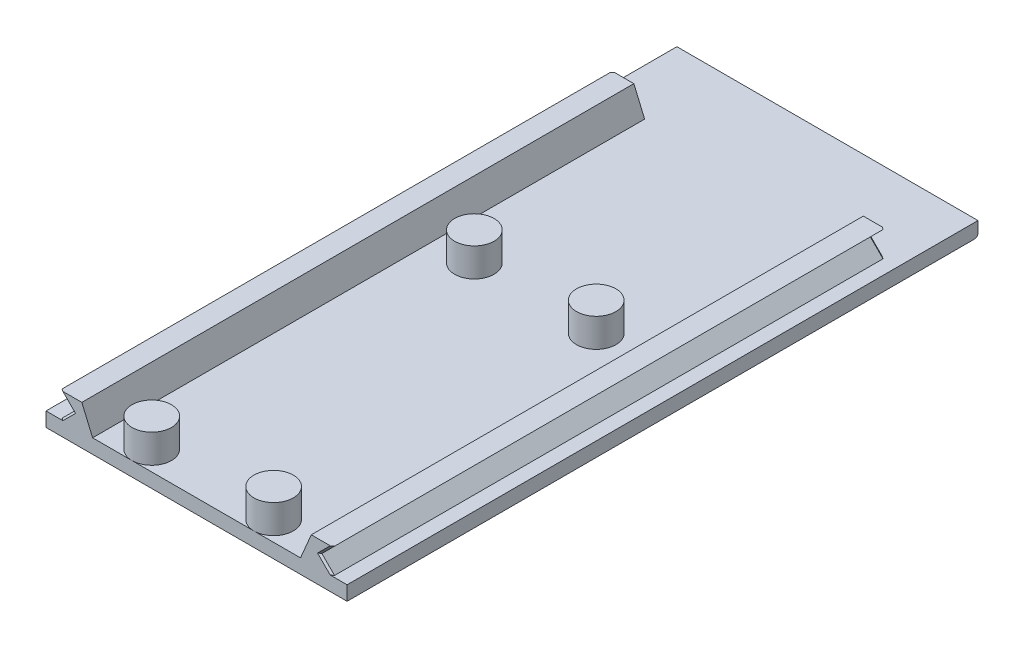
ISO-10303-21;
HEADER;
FILE_DESCRIPTION(('STEP AP214'),'2;1');
FILE_NAME('part.step','',(''),(''),'','','');
FILE_SCHEMA(('AUTOMOTIVE_DESIGN { 1 0 10303 214 1 1 1 1 }'));
ENDSEC;
DATA;
#1=APPLICATION_CONTEXT('core data for automotive mechanical design processes');
#2=APPLICATION_PROTOCOL_DEFINITION('international standard','automotive_design',2000,#1);
#3=PRODUCT_CONTEXT('',#1,'mechanical');
#4=PRODUCT('Part','Part','',(#3));
#5=PRODUCT_RELATED_PRODUCT_CATEGORY('part','',(#4));
#6=PRODUCT_DEFINITION_FORMATION('','',#4);
#7=PRODUCT_DEFINITION_CONTEXT('part definition',#1,'design');
#8=PRODUCT_DEFINITION('design','',#6,#7);
#9=PRODUCT_DEFINITION_SHAPE('','',#8);
#10=(LENGTH_UNIT() NAMED_UNIT(*) SI_UNIT(.MILLI.,.METRE.));
#11=(NAMED_UNIT(*) PLANE_ANGLE_UNIT() SI_UNIT($,.RADIAN.));
#12=(NAMED_UNIT(*) SI_UNIT($,.STERADIAN.) SOLID_ANGLE_UNIT());
#13=UNCERTAINTY_MEASURE_WITH_UNIT(LENGTH_MEASURE(1.E-05),#10,'distance_accuracy_value','');
#14=(GEOMETRIC_REPRESENTATION_CONTEXT(3) GLOBAL_UNCERTAINTY_ASSIGNED_CONTEXT((#13)) GLOBAL_UNIT_ASSIGNED_CONTEXT((#10,
#11,#12)) REPRESENTATION_CONTEXT('',''));
#15=CARTESIAN_POINT('',(0.,0.,0.));
#16=DIRECTION('',(0.,0.,1.));
#17=DIRECTION('',(1.,0.,0.));
#18=AXIS2_PLACEMENT_3D('',#15,#16,#17);
#19=CARTESIAN_POINT('',(0.,2.,0.));
#20=DIRECTION('',(0.,1.,0.));
#21=DIRECTION('',(0.,0.,1.));
#22=AXIS2_PLACEMENT_3D('',#19,#20,#21);
#23=PLANE('',#22);
#24=CARTESIAN_POINT('',(-9.00000000000015,2.,-3.75));
#25=DIRECTION('',(0.,1.,0.));
#26=DIRECTION('',(0.,0.,1.));
#27=AXIS2_PLACEMENT_3D('',#24,#25,#26);
#28=CIRCLE('',#27,2.75);
#29=CARTESIAN_POINT('',(-9.00000000000015,2.,-0.999999999999997));
#30=VERTEX_POINT('',#29);
#31=EDGE_CURVE('E412',#30,#30,#28,.T.);
#32=ORIENTED_EDGE('',*,*,#31,.F.);
#33=EDGE_LOOP('',(#32));
#34=FACE_BOUND('',#33,.T.);
#35=CARTESIAN_POINT('',(7.99999999999985,2.,-3.75));
#36=DIRECTION('',(0.,1.,0.));
#37=DIRECTION('',(0.,0.,1.));
#38=AXIS2_PLACEMENT_3D('',#35,#36,#37);
#39=CIRCLE('',#38,2.75);
#40=CARTESIAN_POINT('',(7.99999999999985,2.,-0.999999999999995));
#41=VERTEX_POINT('',#40);
#42=EDGE_CURVE('E618',#41,#41,#39,.T.);
#43=ORIENTED_EDGE('',*,*,#42,.F.);
#44=EDGE_LOOP('',(#43));
#45=FACE_BOUND('',#44,.T.);
#46=DIRECTION('',(1.,0.,0.));
#47=VECTOR('',#46,1.);
#48=CARTESIAN_POINT('',(-21.,2.,44.));
#49=LINE('',#48,#47);
#50=CARTESIAN_POINT('',(-9.,2.,44.));
#51=VERTEX_POINT('',#50);
#52=CARTESIAN_POINT('',(8.,2.,44.));
#53=VERTEX_POINT('',#52);
#54=EDGE_CURVE('E470',#51,#53,#49,.T.);
#55=ORIENTED_EDGE('',*,*,#54,.T.);
#56=CARTESIAN_POINT('',(8.,2.,41.25));
#57=DIRECTION('',(0.,1.,0.));
#58=DIRECTION('',(0.,0.,1.));
#59=AXIS2_PLACEMENT_3D('',#56,#57,#58);
#60=CIRCLE('',#59,2.75);
#61=EDGE_CURVE('E468',#53,#53,#60,.T.);
#62=ORIENTED_EDGE('',*,*,#61,.F.);
#63=CARTESIAN_POINT('',(14.5,2.,44.));
#64=VERTEX_POINT('',#63);
#65=EDGE_CURVE('E303',#53,#64,#49,.T.);
#66=ORIENTED_EDGE('',*,*,#65,.T.);
#67=DIRECTION('',(0.,0.,1.));
#68=VECTOR('',#67,1.);
#69=CARTESIAN_POINT('',(14.5,2.,-33.));
#70=LINE('',#69,#68);
#71=CARTESIAN_POINT('',(14.5,2.,-33.));
#72=VERTEX_POINT('',#71);
#73=EDGE_CURVE('E267',#72,#64,#70,.T.);
#74=ORIENTED_EDGE('',*,*,#73,.F.);
#75=DIRECTION('',(1.,0.,0.));
#76=VECTOR('',#75,1.);
#77=CARTESIAN_POINT('',(19.,2.,-33.));
#78=LINE('',#77,#76);
#79=CARTESIAN_POINT('',(18.6464466094067,2.,-33.));
#80=VERTEX_POINT('',#79);
#81=EDGE_CURVE('E249',#72,#80,#78,.T.);
#82=ORIENTED_EDGE('',*,*,#81,.T.);
#83=DIRECTION('',(-0.816496580927736,0.,-0.577350269189611));
#84=VECTOR('',#83,1.);
#85=CARTESIAN_POINT('',(17.8214886980224,2.,-33.5833333333333));
#86=LINE('',#85,#84);
#87=CARTESIAN_POINT('',(19.,2.,-32.75));
#88=VERTEX_POINT('',#87);
#89=EDGE_CURVE('E404',#80,#88,#86,.F.);
#90=ORIENTED_EDGE('',*,*,#89,.T.);
#91=DIRECTION('',(0.,0.,1.));
#92=VECTOR('',#91,1.);
#93=CARTESIAN_POINT('',(19.,2.,-33.));
#94=LINE('',#93,#92);
#95=CARTESIAN_POINT('',(19.,2.,43.75));
#96=VERTEX_POINT('',#95);
#97=EDGE_CURVE('E261',#88,#96,#94,.T.);
#98=ORIENTED_EDGE('',*,*,#97,.T.);
#99=DIRECTION('',(-0.81649658092773,0.,0.577350269189621));
#100=VECTOR('',#99,1.);
#101=CARTESIAN_POINT('',(5.43096440627088,2.,53.3447570824874));
#102=LINE('',#101,#100);
#103=CARTESIAN_POINT('',(18.6464466094067,2.,44.));
#104=VERTEX_POINT('',#103);
#105=EDGE_CURVE('E11',#96,#104,#102,.T.);
#106=ORIENTED_EDGE('',*,*,#105,.T.);
#107=CARTESIAN_POINT('',(21.,2.,44.));
#108=VERTEX_POINT('',#107);
#109=EDGE_CURVE('E298',#104,#108,#49,.T.);
#110=ORIENTED_EDGE('',*,*,#109,.T.);
#111=DIRECTION('',(0.,0.,-1.));
#112=VECTOR('',#111,1.);
#113=CARTESIAN_POINT('',(21.,2.,-44.));
#114=LINE('',#113,#112);
#115=CARTESIAN_POINT('',(21.,2.,-44.));
#116=VERTEX_POINT('',#115);
#117=EDGE_CURVE('E287',#108,#116,#114,.T.);
#118=ORIENTED_EDGE('',*,*,#117,.T.);
#119=DIRECTION('',(-1.,0.,0.));
#120=VECTOR('',#119,1.);
#121=CARTESIAN_POINT('',(-21.,2.,-44.));
#122=LINE('',#121,#120);
#123=CARTESIAN_POINT('',(-21.,2.,-44.));
#124=VERTEX_POINT('',#123);
#125=EDGE_CURVE('E291',#116,#124,#122,.T.);
#126=ORIENTED_EDGE('',*,*,#125,.T.);
#127=DIRECTION('',(0.,0.,1.));
#128=VECTOR('',#127,1.);
#129=CARTESIAN_POINT('',(-21.,2.,-44.));
#130=LINE('',#129,#128);
#131=CARTESIAN_POINT('',(-21.,2.,44.));
#132=VERTEX_POINT('',#131);
#133=EDGE_CURVE('E295',#124,#132,#130,.T.);
#134=ORIENTED_EDGE('',*,*,#133,.T.);
#135=CARTESIAN_POINT('',(-18.6464466094067,2.,44.));
#136=VERTEX_POINT('',#135);
#137=EDGE_CURVE('E60',#132,#136,#49,.T.);
#138=ORIENTED_EDGE('',*,*,#137,.T.);
#139=DIRECTION('',(0.816496580927728,0.,0.577350269189623));
#140=VECTOR('',#139,1.);
#141=CARTESIAN_POINT('',(-17.8214886980224,2.,44.5833333333333));
#142=LINE('',#141,#140);
#143=CARTESIAN_POINT('',(-19.,2.,43.75));
#144=VERTEX_POINT('',#143);
#145=EDGE_CURVE('E52',#136,#144,#142,.F.);
#146=ORIENTED_EDGE('',*,*,#145,.T.);
#147=DIRECTION('',(0.,0.,1.));
#148=VECTOR('',#147,1.);
#149=CARTESIAN_POINT('',(-19.,2.,-33.));
#150=LINE('',#149,#148);
#151=CARTESIAN_POINT('',(-19.,2.,-32.75));
#152=VERTEX_POINT('',#151);
#153=EDGE_CURVE('E235',#152,#144,#150,.T.);
#154=ORIENTED_EDGE('',*,*,#153,.F.);
#155=DIRECTION('',(0.816496580927716,0.,-0.57735026918964));
#156=VECTOR('',#155,1.);
#157=CARTESIAN_POINT('',(-13.0976310729379,2.,-36.9236050933905));
#158=LINE('',#157,#156);
#159=CARTESIAN_POINT('',(-18.6464466094068,2.,-33.));
#160=VERTEX_POINT('',#159);
#161=EDGE_CURVE('E401',#152,#160,#158,.T.);
#162=ORIENTED_EDGE('',*,*,#161,.T.);
#163=DIRECTION('',(-1.,0.,0.));
#164=VECTOR('',#163,1.);
#165=CARTESIAN_POINT('',(-19.,2.,-33.));
#166=LINE('',#165,#164);
#167=CARTESIAN_POINT('',(-14.5,2.,-33.));
#168=VERTEX_POINT('',#167);
#169=EDGE_CURVE('E223',#168,#160,#166,.T.);
#170=ORIENTED_EDGE('',*,*,#169,.F.);
#171=DIRECTION('',(0.,0.,1.));
#172=VECTOR('',#171,1.);
#173=CARTESIAN_POINT('',(-14.5,2.,-33.));
#174=LINE('',#173,#172);
#175=CARTESIAN_POINT('',(-14.5,2.,44.));
#176=VERTEX_POINT('',#175);
#177=EDGE_CURVE('E208',#168,#176,#174,.T.);
#178=ORIENTED_EDGE('',*,*,#177,.T.);
#179=EDGE_CURVE('E302',#176,#51,#49,.T.);
#180=ORIENTED_EDGE('',*,*,#179,.T.);
#181=CARTESIAN_POINT('',(-9.,2.,41.25));
#182=DIRECTION('',(0.,1.,0.));
#183=DIRECTION('',(0.,0.,1.));
#184=AXIS2_PLACEMENT_3D('',#181,#182,#183);
#185=CIRCLE('',#184,2.75);
#186=EDGE_CURVE('E475',#51,#51,#185,.T.);
#187=ORIENTED_EDGE('',*,*,#186,.F.);
#188=EDGE_LOOP('',(#55,#62,#66,#74,#82,#90,#98,#106,#110,#118,#126,#134,#138,#146,#154,#162,
#170,#178,#180,#187));
#189=FACE_BOUND('',#188,.T.);
#190=ADVANCED_FACE('F41',(#34,#45,#189),#23,.T.);
#191=CARTESIAN_POINT('',(21.,2.,-44.));
#192=DIRECTION('',(-1.,0.,0.));
#193=DIRECTION('',(0.,0.,1.));
#194=AXIS2_PLACEMENT_3D('',#191,#192,#193);
#195=PLANE('',#194);
#196=DIRECTION('',(0.,0.,-1.));
#197=VECTOR('',#196,1.);
#198=CARTESIAN_POINT('',(21.,0.,-44.));
#199=LINE('',#198,#197);
#200=CARTESIAN_POINT('',(21.,0.,44.));
#201=VERTEX_POINT('',#200);
#202=CARTESIAN_POINT('',(21.,0.,-43.5));
#203=VERTEX_POINT('',#202);
#204=EDGE_CURVE('E271',#201,#203,#199,.T.);
#205=ORIENTED_EDGE('',*,*,#204,.T.);
#206=CARTESIAN_POINT('',(21.,0.5,-43.5));
#207=DIRECTION('',(-1.,0.,0.));
#208=DIRECTION('',(0.,0.,1.));
#209=AXIS2_PLACEMENT_3D('',#206,#207,#208);
#210=CIRCLE('',#209,0.5);
#211=CARTESIAN_POINT('',(21.,0.5,-44.));
#212=VERTEX_POINT('',#211);
#213=EDGE_CURVE('E337',#203,#212,#210,.F.);
#214=ORIENTED_EDGE('',*,*,#213,.T.);
#215=DIRECTION('',(0.,-1.,0.));
#216=VECTOR('',#215,1.);
#217=CARTESIAN_POINT('',(21.,2.,-44.));
#218=LINE('',#217,#216);
#219=EDGE_CURVE('E323',#116,#212,#218,.T.);
#220=ORIENTED_EDGE('',*,*,#219,.F.);
#221=ORIENTED_EDGE('',*,*,#117,.F.);
#222=DIRECTION('',(0.,-1.,0.));
#223=VECTOR('',#222,1.);
#224=CARTESIAN_POINT('',(21.,2.,44.));
#225=LINE('',#224,#223);
#226=EDGE_CURVE('E301',#108,#201,#225,.T.);
#227=ORIENTED_EDGE('',*,*,#226,.T.);
#228=EDGE_LOOP('',(#205,#214,#220,#221,#227));
#229=FACE_BOUND('',#228,.T.);
#230=ADVANCED_FACE('F508',(#229),#195,.F.);
#231=CARTESIAN_POINT('',(-21.,2.,-44.));
#232=DIRECTION('',(0.,0.,1.));
#233=DIRECTION('',(1.,0.,0.));
#234=AXIS2_PLACEMENT_3D('',#231,#232,#233);
#235=PLANE('',#234);
#236=ORIENTED_EDGE('',*,*,#219,.T.);
#237=DIRECTION('',(-1.,0.,0.));
#238=VECTOR('',#237,1.);
#239=CARTESIAN_POINT('',(-21.,0.5,-44.));
#240=LINE('',#239,#238);
#241=CARTESIAN_POINT('',(-21.,0.5,-44.));
#242=VERTEX_POINT('',#241);
#243=EDGE_CURVE('E327',#212,#242,#240,.T.);
#244=ORIENTED_EDGE('',*,*,#243,.T.);
#245=DIRECTION('',(0.,-1.,0.));
#246=VECTOR('',#245,1.);
#247=CARTESIAN_POINT('',(-21.,2.,-44.));
#248=LINE('',#247,#246);
#249=EDGE_CURVE('E319',#124,#242,#248,.T.);
#250=ORIENTED_EDGE('',*,*,#249,.F.);
#251=ORIENTED_EDGE('',*,*,#125,.F.);
#252=EDGE_LOOP('',(#236,#244,#250,#251));
#253=FACE_BOUND('',#252,.T.);
#254=ADVANCED_FACE('F515',(#253),#235,.F.);
#255=CARTESIAN_POINT('',(-21.,2.,-44.));
#256=DIRECTION('',(1.,0.,0.));
#257=DIRECTION('',(0.,0.,-1.));
#258=AXIS2_PLACEMENT_3D('',#255,#256,#257);
#259=PLANE('',#258);
#260=ORIENTED_EDGE('',*,*,#249,.T.);
#261=CARTESIAN_POINT('',(-21.,0.5,-43.5));
#262=DIRECTION('',(1.,0.,0.));
#263=DIRECTION('',(0.,0.,-1.));
#264=AXIS2_PLACEMENT_3D('',#261,#262,#263);
#265=CIRCLE('',#264,0.5);
#266=CARTESIAN_POINT('',(-21.,0.,-43.5));
#267=VERTEX_POINT('',#266);
#268=EDGE_CURVE('E331',#242,#267,#265,.F.);
#269=ORIENTED_EDGE('',*,*,#268,.T.);
#270=DIRECTION('',(0.,0.,1.));
#271=VECTOR('',#270,1.);
#272=CARTESIAN_POINT('',(-21.,0.,-44.));
#273=LINE('',#272,#271);
#274=CARTESIAN_POINT('',(-21.,0.,44.));
#275=VERTEX_POINT('',#274);
#276=EDGE_CURVE('E307',#267,#275,#273,.T.);
#277=ORIENTED_EDGE('',*,*,#276,.T.);
#278=DIRECTION('',(0.,-1.,0.));
#279=VECTOR('',#278,1.);
#280=CARTESIAN_POINT('',(-21.,2.,44.));
#281=LINE('',#280,#279);
#282=EDGE_CURVE('E315',#132,#275,#281,.T.);
#283=ORIENTED_EDGE('',*,*,#282,.F.);
#284=ORIENTED_EDGE('',*,*,#133,.F.);
#285=EDGE_LOOP('',(#260,#269,#277,#283,#284));
#286=FACE_BOUND('',#285,.T.);
#287=ADVANCED_FACE('F516',(#286),#259,.F.);
#288=CARTESIAN_POINT('',(-21.,2.,44.));
#289=DIRECTION('',(0.,0.,-1.));
#290=DIRECTION('',(-1.,0.,0.));
#291=AXIS2_PLACEMENT_3D('',#288,#289,#290);
#292=PLANE('',#291);
#293=DIRECTION('',(-0.707106781186552,-0.707106781186543,0.));
#294=VECTOR('',#293,1.);
#295=CARTESIAN_POINT('',(-19.8232233047034,0.823223304703363,44.));
#296=LINE('',#295,#294);
#297=CARTESIAN_POINT('',(-16.8786796564403,3.76776695296636,44.));
#298=VERTEX_POINT('',#297);
#299=EDGE_CURVE('E398',#298,#136,#296,.T.);
#300=ORIENTED_EDGE('',*,*,#299,.T.);
#301=ORIENTED_EDGE('',*,*,#137,.F.);
#302=ORIENTED_EDGE('',*,*,#282,.T.);
#303=DIRECTION('',(1.,0.,0.));
#304=VECTOR('',#303,1.);
#305=CARTESIAN_POINT('',(-21.,0.,44.));
#306=LINE('',#305,#304);
#307=EDGE_CURVE('E292',#275,#201,#306,.T.);
#308=ORIENTED_EDGE('',*,*,#307,.T.);
#309=ORIENTED_EDGE('',*,*,#226,.F.);
#310=ORIENTED_EDGE('',*,*,#109,.F.);
#311=DIRECTION('',(-0.707106781186552,0.707106781186543,0.));
#312=VECTOR('',#311,1.);
#313=CARTESIAN_POINT('',(17.055456351737,3.59099025766972,44.));
#314=LINE('',#313,#312);
#315=CARTESIAN_POINT('',(16.8786796564404,3.76776695296635,44.));
#316=VERTEX_POINT('',#315);
#317=EDGE_CURVE('E392',#104,#316,#314,.T.);
#318=ORIENTED_EDGE('',*,*,#317,.T.);
#319=DIRECTION('',(0.707106781186548,0.707106781186548,0.));
#320=VECTOR('',#319,1.);
#321=CARTESIAN_POINT('',(18.8232233047034,5.71231060122937,44.));
#322=LINE('',#321,#320);
#323=CARTESIAN_POINT('',(18.6464466094067,5.53553390593273,44.));
#324=VERTEX_POINT('',#323);
#325=EDGE_CURVE('E389',#316,#324,#322,.T.);
#326=ORIENTED_EDGE('',*,*,#325,.T.);
#327=DIRECTION('',(-1.,0.,0.));
#328=VECTOR('',#327,1.);
#329=CARTESIAN_POINT('',(16.,5.53553390593273,44.));
#330=LINE('',#329,#328);
#331=CARTESIAN_POINT('',(16.,5.53553390593273,44.));
#332=VERTEX_POINT('',#331);
#333=EDGE_CURVE('E239',#324,#332,#330,.T.);
#334=ORIENTED_EDGE('',*,*,#333,.T.);
#335=DIRECTION('',(-0.390566732942471,-0.920574617898324,0.));
#336=VECTOR('',#335,1.);
#337=CARTESIAN_POINT('',(14.5,2.,44.));
#338=LINE('',#337,#336);
#339=EDGE_CURVE('E254',#332,#64,#338,.T.);
#340=ORIENTED_EDGE('',*,*,#339,.T.);
#341=ORIENTED_EDGE('',*,*,#65,.F.);
#342=ORIENTED_EDGE('',*,*,#54,.F.);
#343=ORIENTED_EDGE('',*,*,#179,.F.);
#344=DIRECTION('',(0.390566732942471,-0.920574617898324,0.));
#345=VECTOR('',#344,1.);
#346=CARTESIAN_POINT('',(-14.5,2.,44.));
#347=LINE('',#346,#345);
#348=CARTESIAN_POINT('',(-16.,5.53553390593273,44.));
#349=VERTEX_POINT('',#348);
#350=EDGE_CURVE('E229',#349,#176,#347,.T.);
#351=ORIENTED_EDGE('',*,*,#350,.F.);
#352=DIRECTION('',(1.,0.,0.));
#353=VECTOR('',#352,1.);
#354=CARTESIAN_POINT('',(-16.,5.53553390593273,44.));
#355=LINE('',#354,#353);
#356=CARTESIAN_POINT('',(-18.6464466094067,5.53553390593273,44.));
#357=VERTEX_POINT('',#356);
#358=EDGE_CURVE('E213',#357,#349,#355,.T.);
#359=ORIENTED_EDGE('',*,*,#358,.F.);
#360=DIRECTION('',(0.707106781186548,-0.707106781186548,0.));
#361=VECTOR('',#360,1.);
#362=CARTESIAN_POINT('',(-18.055456351737,4.944543648263,44.));
#363=LINE('',#362,#361);
#364=EDGE_CURVE('E67',#357,#298,#363,.T.);
#365=ORIENTED_EDGE('',*,*,#364,.T.);
#366=EDGE_LOOP('',(#300,#301,#302,#308,#309,#310,#318,#326,#334,#340,#341,#342,#343,#351,#359,#365));
#367=FACE_BOUND('',#366,.T.);
#368=ADVANCED_FACE('F434',(#367),#292,.F.);
#369=CARTESIAN_POINT('',(0.,0.,0.));
#370=DIRECTION('',(0.,1.,0.));
#371=DIRECTION('',(0.,0.,1.));
#372=AXIS2_PLACEMENT_3D('',#369,#370,#371);
#373=PLANE('',#372);
#374=ORIENTED_EDGE('',*,*,#276,.F.);
#375=DIRECTION('',(-1.,0.,0.));
#376=VECTOR('',#375,1.);
#377=CARTESIAN_POINT('',(0.,0.,-43.5));
#378=LINE('',#377,#376);
#379=EDGE_CURVE('E334',#267,#203,#378,.F.);
#380=ORIENTED_EDGE('',*,*,#379,.T.);
#381=ORIENTED_EDGE('',*,*,#204,.F.);
#382=ORIENTED_EDGE('',*,*,#307,.F.);
#383=EDGE_LOOP('',(#374,#380,#381,#382));
#384=FACE_BOUND('',#383,.T.);
#385=ADVANCED_FACE('F504',(#384),#373,.F.);
#386=CARTESIAN_POINT('',(14.5,2.,-33.));
#387=DIRECTION('',(-0.920574617898324,0.39056673294247,0.));
#388=DIRECTION('',(-0.390566732942471,-0.920574617898324,0.));
#389=AXIS2_PLACEMENT_3D('',#386,#387,#388);
#390=PLANE('',#389);
#391=ORIENTED_EDGE('',*,*,#339,.F.);
#392=DIRECTION('',(0.,0.,1.));
#393=VECTOR('',#392,1.);
#394=CARTESIAN_POINT('',(16.,5.53553390593273,-33.));
#395=LINE('',#394,#393);
#396=CARTESIAN_POINT('',(16.,5.53553390593273,-33.));
#397=VERTEX_POINT('',#396);
#398=EDGE_CURVE('E272',#397,#332,#395,.T.);
#399=ORIENTED_EDGE('',*,*,#398,.F.);
#400=DIRECTION('',(-0.390566732942471,-0.920574617898324,0.));
#401=VECTOR('',#400,1.);
#402=CARTESIAN_POINT('',(14.5,2.,-33.));
#403=LINE('',#402,#401);
#404=EDGE_CURVE('E257',#397,#72,#403,.T.);
#405=ORIENTED_EDGE('',*,*,#404,.T.);
#406=ORIENTED_EDGE('',*,*,#73,.T.);
#407=EDGE_LOOP('',(#391,#399,#405,#406));
#408=FACE_BOUND('',#407,.T.);
#409=ADVANCED_FACE('F464',(#408),#390,.T.);
#410=CARTESIAN_POINT('',(16.,5.53553390593273,-33.));
#411=DIRECTION('',(0.,1.,0.));
#412=DIRECTION('',(0.,0.,1.));
#413=AXIS2_PLACEMENT_3D('',#410,#411,#412);
#414=PLANE('',#413);
#415=DIRECTION('',(0.,0.,1.));
#416=VECTOR('',#415,1.);
#417=CARTESIAN_POINT('',(19.,5.53553390593273,-33.));
#418=LINE('',#417,#416);
#419=CARTESIAN_POINT('',(19.,5.53553390593273,-32.75));
#420=VERTEX_POINT('',#419);
#421=CARTESIAN_POINT('',(19.,5.53553390593273,43.75));
#422=VERTEX_POINT('',#421);
#423=EDGE_CURVE('E276',#420,#422,#418,.T.);
#424=ORIENTED_EDGE('',*,*,#423,.F.);
#425=DIRECTION('',(0.816496580927728,0.,0.577350269189623));
#426=VECTOR('',#425,1.);
#427=CARTESIAN_POINT('',(16.8821488698022,5.53553390593273,-34.2475468957064));
#428=LINE('',#427,#426);
#429=CARTESIAN_POINT('',(18.6464466094067,5.53553390593273,-33.));
#430=VERTEX_POINT('',#429);
#431=EDGE_CURVE('E374',#420,#430,#428,.F.);
#432=ORIENTED_EDGE('',*,*,#431,.T.);
#433=DIRECTION('',(-1.,0.,0.));
#434=VECTOR('',#433,1.);
#435=CARTESIAN_POINT('',(16.,5.53553390593273,-33.));
#436=LINE('',#435,#434);
#437=EDGE_CURVE('E253',#430,#397,#436,.T.);
#438=ORIENTED_EDGE('',*,*,#437,.T.);
#439=ORIENTED_EDGE('',*,*,#398,.T.);
#440=ORIENTED_EDGE('',*,*,#333,.F.);
#441=DIRECTION('',(0.816496580927728,0.,-0.577350269189623));
#442=VECTOR('',#441,1.);
#443=CARTESIAN_POINT('',(53.1802969707116,5.53553390593273,19.58088022904));
#444=LINE('',#443,#442);
#445=EDGE_CURVE('E371',#324,#422,#444,.T.);
#446=ORIENTED_EDGE('',*,*,#445,.T.);
#447=EDGE_LOOP('',(#424,#432,#438,#439,#440,#446));
#448=FACE_BOUND('',#447,.T.);
#449=ADVANCED_FACE('F457',(#448),#414,.T.);
#450=CARTESIAN_POINT('',(19.,5.53553390593273,-33.));
#451=DIRECTION('',(0.707106781186548,-0.707106781186548,0.));
#452=DIRECTION('',(0.707106781186548,0.707106781186548,0.));
#453=AXIS2_PLACEMENT_3D('',#450,#451,#452);
#454=PLANE('',#453);
#455=DIRECTION('',(0.,0.,1.));
#456=VECTOR('',#455,1.);
#457=CARTESIAN_POINT('',(17.2322330470336,3.76776695296636,-33.));
#458=LINE('',#457,#456);
#459=CARTESIAN_POINT('',(17.2322330470336,3.76776695296636,-32.75));
#460=VERTEX_POINT('',#459);
#461=CARTESIAN_POINT('',(17.2322330470336,3.76776695296636,43.75));
#462=VERTEX_POINT('',#461);
#463=EDGE_CURVE('E280',#460,#462,#458,.T.);
#464=ORIENTED_EDGE('',*,*,#463,.F.);
#465=DIRECTION('',(0.707106781186548,0.707106781186548,0.));
#466=VECTOR('',#465,1.);
#467=CARTESIAN_POINT('',(19.,5.53553390593273,-32.75));
#468=LINE('',#467,#466);
#469=EDGE_CURVE('E367',#460,#420,#468,.T.);
#470=ORIENTED_EDGE('',*,*,#469,.T.);
#471=ORIENTED_EDGE('',*,*,#423,.T.);
#472=DIRECTION('',(-0.707106781186548,-0.707106781186548,0.));
#473=VECTOR('',#472,1.);
#474=CARTESIAN_POINT('',(17.2322330470336,3.76776695296636,43.75));
#475=LINE('',#474,#473);
#476=EDGE_CURVE('E364',#422,#462,#475,.T.);
#477=ORIENTED_EDGE('',*,*,#476,.T.);
#478=EDGE_LOOP('',(#464,#470,#471,#477));
#479=FACE_BOUND('',#478,.T.);
#480=ADVANCED_FACE('F455',(#479),#454,.T.);
#481=CARTESIAN_POINT('',(17.2322330470336,3.76776695296636,-33.));
#482=DIRECTION('',(0.707106781186543,0.707106781186552,0.));
#483=DIRECTION('',(-0.707106781186552,0.707106781186543,0.));
#484=AXIS2_PLACEMENT_3D('',#481,#482,#483);
#485=PLANE('',#484);
#486=ORIENTED_EDGE('',*,*,#97,.F.);
#487=DIRECTION('',(-0.707106781186552,0.707106781186543,0.));
#488=VECTOR('',#487,1.);
#489=CARTESIAN_POINT('',(17.2322330470336,3.76776695296636,-32.75));
#490=LINE('',#489,#488);
#491=EDGE_CURVE('E386',#88,#460,#490,.T.);
#492=ORIENTED_EDGE('',*,*,#491,.T.);
#493=ORIENTED_EDGE('',*,*,#463,.T.);
#494=DIRECTION('',(0.707106781186552,-0.707106781186543,0.));
#495=VECTOR('',#494,1.);
#496=CARTESIAN_POINT('',(19.,2.,43.75));
#497=LINE('',#496,#495);
#498=EDGE_CURVE('E383',#462,#96,#497,.T.);
#499=ORIENTED_EDGE('',*,*,#498,.T.);
#500=EDGE_LOOP('',(#486,#492,#493,#499));
#501=FACE_BOUND('',#500,.T.);
#502=ADVANCED_FACE('F443',(#501),#485,.T.);
#503=CARTESIAN_POINT('',(0.,0.,-33.));
#504=DIRECTION('',(0.,0.,-1.));
#505=DIRECTION('',(-1.,0.,0.));
#506=AXIS2_PLACEMENT_3D('',#503,#504,#505);
#507=PLANE('',#506);
#508=ORIENTED_EDGE('',*,*,#437,.F.);
#509=DIRECTION('',(-0.707106781186548,-0.707106781186548,0.));
#510=VECTOR('',#509,1.);
#511=CARTESIAN_POINT('',(6.55545635173701,-6.55545635173701,-33.));
#512=LINE('',#511,#510);
#513=CARTESIAN_POINT('',(16.8786796564404,3.76776695296635,-33.));
#514=VERTEX_POINT('',#513);
#515=EDGE_CURVE('E380',#430,#514,#512,.T.);
#516=ORIENTED_EDGE('',*,*,#515,.T.);
#517=DIRECTION('',(0.707106781186552,-0.707106781186543,0.));
#518=VECTOR('',#517,1.);
#519=CARTESIAN_POINT('',(10.3232233047033,10.3232233047034,-33.));
#520=LINE('',#519,#518);
#521=EDGE_CURVE('E377',#514,#80,#520,.T.);
#522=ORIENTED_EDGE('',*,*,#521,.T.);
#523=ORIENTED_EDGE('',*,*,#81,.F.);
#524=ORIENTED_EDGE('',*,*,#404,.F.);
#525=EDGE_LOOP('',(#508,#516,#522,#523,#524));
#526=FACE_BOUND('',#525,.T.);
#527=ADVANCED_FACE('F547',(#526),#507,.T.);
#528=CARTESIAN_POINT('',(-17.2322330470337,3.76776695296636,-33.));
#529=DIRECTION('',(0.707106781186543,-0.707106781186552,0.));
#530=DIRECTION('',(0.707106781186552,0.707106781186543,0.));
#531=AXIS2_PLACEMENT_3D('',#528,#529,#530);
#532=PLANE('',#531);
#533=DIRECTION('',(0.,0.,1.));
#534=VECTOR('',#533,1.);
#535=CARTESIAN_POINT('',(-17.2322330470337,3.76776695296636,-33.));
#536=LINE('',#535,#534);
#537=CARTESIAN_POINT('',(-17.2322330470337,3.76776695296636,-32.75));
#538=VERTEX_POINT('',#537);
#539=CARTESIAN_POINT('',(-17.2322330470336,3.76776695296636,43.75));
#540=VERTEX_POINT('',#539);
#541=EDGE_CURVE('E240',#538,#540,#536,.T.);
#542=ORIENTED_EDGE('',*,*,#541,.F.);
#543=DIRECTION('',(-0.707106781186552,-0.707106781186543,0.));
#544=VECTOR('',#543,1.);
#545=CARTESIAN_POINT('',(-19.,2.,-32.75));
#546=LINE('',#545,#544);
#547=EDGE_CURVE('E349',#538,#152,#546,.T.);
#548=ORIENTED_EDGE('',*,*,#547,.T.);
#549=ORIENTED_EDGE('',*,*,#153,.T.);
#550=DIRECTION('',(0.707106781186552,0.707106781186543,0.));
#551=VECTOR('',#550,1.);
#552=CARTESIAN_POINT('',(-17.2322330470336,3.76776695296633,43.75));
#553=LINE('',#552,#551);
#554=EDGE_CURVE('E345',#144,#540,#553,.T.);
#555=ORIENTED_EDGE('',*,*,#554,.T.);
#556=EDGE_LOOP('',(#542,#548,#549,#555));
#557=FACE_BOUND('',#556,.T.);
#558=ADVANCED_FACE('F483',(#557),#532,.F.);
#559=CARTESIAN_POINT('',(-19.,5.53553390593273,-33.));
#560=DIRECTION('',(0.707106781186548,0.707106781186548,0.));
#561=DIRECTION('',(-0.707106781186548,0.707106781186548,0.));
#562=AXIS2_PLACEMENT_3D('',#559,#560,#561);
#563=PLANE('',#562);
#564=DIRECTION('',(0.,0.,1.));
#565=VECTOR('',#564,1.);
#566=CARTESIAN_POINT('',(-19.,5.53553390593273,-33.));
#567=LINE('',#566,#565);
#568=CARTESIAN_POINT('',(-19.,5.53553390593273,-32.75));
#569=VERTEX_POINT('',#568);
#570=CARTESIAN_POINT('',(-19.,5.53553390593273,43.75));
#571=VERTEX_POINT('',#570);
#572=EDGE_CURVE('E218',#569,#571,#567,.T.);
#573=ORIENTED_EDGE('',*,*,#572,.F.);
#574=DIRECTION('',(0.707106781186548,-0.707106781186548,0.));
#575=VECTOR('',#574,1.);
#576=CARTESIAN_POINT('',(-17.2322330470337,3.76776695296636,-32.75));
#577=LINE('',#576,#575);
#578=EDGE_CURVE('E361',#569,#538,#577,.T.);
#579=ORIENTED_EDGE('',*,*,#578,.T.);
#580=ORIENTED_EDGE('',*,*,#541,.T.);
#581=DIRECTION('',(-0.707106781186548,0.707106781186548,0.));
#582=VECTOR('',#581,1.);
#583=CARTESIAN_POINT('',(-19.,5.53553390593275,43.75));
#584=LINE('',#583,#582);
#585=EDGE_CURVE('E358',#540,#571,#584,.T.);
#586=ORIENTED_EDGE('',*,*,#585,.T.);
#587=EDGE_LOOP('',(#573,#579,#580,#586));
#588=FACE_BOUND('',#587,.T.);
#589=ADVANCED_FACE('F487',(#588),#563,.F.);
#590=CARTESIAN_POINT('',(-16.,5.53553390593273,-33.));
#591=DIRECTION('',(0.,-1.,0.));
#592=DIRECTION('',(0.,0.,-1.));
#593=AXIS2_PLACEMENT_3D('',#590,#591,#592);
#594=PLANE('',#593);
#595=DIRECTION('',(1.,0.,0.));
#596=VECTOR('',#595,1.);
#597=CARTESIAN_POINT('',(-16.,5.53553390593273,-33.));
#598=LINE('',#597,#596);
#599=CARTESIAN_POINT('',(-18.6464466094067,5.53553390593273,-33.));
#600=VERTEX_POINT('',#599);
#601=CARTESIAN_POINT('',(-16.,5.53553390593273,-33.));
#602=VERTEX_POINT('',#601);
#603=EDGE_CURVE('E195',#600,#602,#598,.T.);
#604=ORIENTED_EDGE('',*,*,#603,.F.);
#605=DIRECTION('',(-0.816496580927714,0.,0.577350269189643));
#606=VECTOR('',#605,1.);
#607=CARTESIAN_POINT('',(-10.5857864376272,5.53553390593273,-38.6997474683059));
#608=LINE('',#607,#606);
#609=EDGE_CURVE('E355',#600,#569,#608,.T.);
#610=ORIENTED_EDGE('',*,*,#609,.T.);
#611=ORIENTED_EDGE('',*,*,#572,.T.);
#612=DIRECTION('',(-0.816496580927724,0.,-0.577350269189628));
#613=VECTOR('',#612,1.);
#614=CARTESIAN_POINT('',(-19.,5.53553390593275,43.75));
#615=LINE('',#614,#613);
#616=EDGE_CURVE('E352',#571,#357,#615,.F.);
#617=ORIENTED_EDGE('',*,*,#616,.T.);
#618=ORIENTED_EDGE('',*,*,#358,.T.);
#619=DIRECTION('',(0.,0.,1.));
#620=VECTOR('',#619,1.);
#621=CARTESIAN_POINT('',(-16.,5.53553390593273,-33.));
#622=LINE('',#621,#620);
#623=EDGE_CURVE('E211',#602,#349,#622,.T.);
#624=ORIENTED_EDGE('',*,*,#623,.F.);
#625=EDGE_LOOP('',(#604,#610,#611,#617,#618,#624));
#626=FACE_BOUND('',#625,.T.);
#627=ADVANCED_FACE('F212',(#626),#594,.F.);
#628=CARTESIAN_POINT('',(-14.5,2.,-33.));
#629=DIRECTION('',(-0.920574617898324,-0.39056673294247,0.));
#630=DIRECTION('',(0.390566732942471,-0.920574617898324,0.));
#631=AXIS2_PLACEMENT_3D('',#628,#629,#630);
#632=PLANE('',#631);
#633=ORIENTED_EDGE('',*,*,#350,.T.);
#634=ORIENTED_EDGE('',*,*,#177,.F.);
#635=DIRECTION('',(0.390566732942471,-0.920574617898324,0.));
#636=VECTOR('',#635,1.);
#637=CARTESIAN_POINT('',(-14.5,2.,-33.));
#638=LINE('',#637,#636);
#639=EDGE_CURVE('E200',#602,#168,#638,.T.);
#640=ORIENTED_EDGE('',*,*,#639,.F.);
#641=ORIENTED_EDGE('',*,*,#623,.T.);
#642=EDGE_LOOP('',(#633,#634,#640,#641));
#643=FACE_BOUND('',#642,.T.);
#644=ADVANCED_FACE('F220',(#643),#632,.F.);
#645=CARTESIAN_POINT('',(0.,0.,-33.));
#646=DIRECTION('',(0.,0.,-1.));
#647=DIRECTION('',(1.,0.,0.));
#648=AXIS2_PLACEMENT_3D('',#645,#646,#647);
#649=PLANE('',#648);
#650=ORIENTED_EDGE('',*,*,#169,.T.);
#651=DIRECTION('',(0.707106781186552,0.707106781186543,0.));
#652=VECTOR('',#651,1.);
#653=CARTESIAN_POINT('',(-17.055456351737,3.59099025766972,-33.));
#654=LINE('',#653,#652);
#655=CARTESIAN_POINT('',(-16.8786796564404,3.76776695296636,-33.));
#656=VERTEX_POINT('',#655);
#657=EDGE_CURVE('E342',#160,#656,#654,.T.);
#658=ORIENTED_EDGE('',*,*,#657,.T.);
#659=DIRECTION('',(-0.707106781186548,0.707106781186548,0.));
#660=VECTOR('',#659,1.);
#661=CARTESIAN_POINT('',(-18.8232233047034,5.71231060122937,-33.));
#662=LINE('',#661,#660);
#663=EDGE_CURVE('E204',#656,#600,#662,.T.);
#664=ORIENTED_EDGE('',*,*,#663,.T.);
#665=ORIENTED_EDGE('',*,*,#603,.T.);
#666=ORIENTED_EDGE('',*,*,#639,.T.);
#667=EDGE_LOOP('',(#650,#658,#664,#665,#666));
#668=FACE_BOUND('',#667,.T.);
#669=ADVANCED_FACE('F198',(#668),#649,.T.);
#670=CARTESIAN_POINT('',(-9.,6.,41.25));
#671=DIRECTION('',(0.,-1.,0.));
#672=DIRECTION('',(0.,0.,-1.));
#673=AXIS2_PLACEMENT_3D('',#670,#671,#672);
#674=CYLINDRICAL_SURFACE('',#673,2.75);
#675=CARTESIAN_POINT('',(-9.,6.,41.25));
#676=DIRECTION('',(0.,1.,0.));
#677=DIRECTION('',(0.,0.,1.));
#678=AXIS2_PLACEMENT_3D('',#675,#676,#677);
#679=CIRCLE('',#678,2.75);
#680=CARTESIAN_POINT('',(-9.,6.,44.));
#681=VERTEX_POINT('',#680);
#682=EDGE_CURVE('E232',#681,#681,#679,.T.);
#683=ORIENTED_EDGE('',*,*,#682,.F.);
#684=EDGE_LOOP('',(#683));
#685=FACE_BOUND('',#684,.T.);
#686=ORIENTED_EDGE('',*,*,#186,.T.);
#687=EDGE_LOOP('',(#686));
#688=FACE_BOUND('',#687,.T.);
#689=ADVANCED_FACE('F573',(#685,#688),#674,.T.);
#690=CARTESIAN_POINT('',(-9.,6.,41.25));
#691=DIRECTION('',(0.,1.,0.));
#692=DIRECTION('',(0.,0.,1.));
#693=AXIS2_PLACEMENT_3D('',#690,#691,#692);
#694=PLANE('',#693);
#695=ORIENTED_EDGE('',*,*,#682,.T.);
#696=EDGE_LOOP('',(#695));
#697=FACE_BOUND('',#696,.T.);
#698=ADVANCED_FACE('F577',(#697),#694,.T.);
#699=CARTESIAN_POINT('',(8.,6.,41.25));
#700=DIRECTION('',(0.,-1.,0.));
#701=DIRECTION('',(0.,0.,-1.));
#702=AXIS2_PLACEMENT_3D('',#699,#700,#701);
#703=CYLINDRICAL_SURFACE('',#702,2.75);
#704=CARTESIAN_POINT('',(8.,6.,41.25));
#705=DIRECTION('',(0.,1.,0.));
#706=DIRECTION('',(0.,0.,1.));
#707=AXIS2_PLACEMENT_3D('',#704,#705,#706);
#708=CIRCLE('',#707,2.75);
#709=CARTESIAN_POINT('',(8.,6.,44.));
#710=VERTEX_POINT('',#709);
#711=EDGE_CURVE('E631',#710,#710,#708,.T.);
#712=ORIENTED_EDGE('',*,*,#711,.F.);
#713=EDGE_LOOP('',(#712));
#714=FACE_BOUND('',#713,.T.);
#715=ORIENTED_EDGE('',*,*,#61,.T.);
#716=EDGE_LOOP('',(#715));
#717=FACE_BOUND('',#716,.T.);
#718=ADVANCED_FACE('F582',(#714,#717),#703,.T.);
#719=CARTESIAN_POINT('',(8.,6.,41.25));
#720=DIRECTION('',(0.,1.,0.));
#721=DIRECTION('',(0.,0.,1.));
#722=AXIS2_PLACEMENT_3D('',#719,#720,#721);
#723=PLANE('',#722);
#724=ORIENTED_EDGE('',*,*,#711,.T.);
#725=EDGE_LOOP('',(#724));
#726=FACE_BOUND('',#725,.T.);
#727=ADVANCED_FACE('F590',(#726),#723,.T.);
#728=CARTESIAN_POINT('',(7.99999999999985,6.,-3.75));
#729=DIRECTION('',(0.,-1.,0.));
#730=DIRECTION('',(0.,0.,-1.));
#731=AXIS2_PLACEMENT_3D('',#728,#729,#730);
#732=CYLINDRICAL_SURFACE('',#731,2.75);
#733=CARTESIAN_POINT('',(7.99999999999985,6.,-3.75));
#734=DIRECTION('',(0.,1.,0.));
#735=DIRECTION('',(0.,0.,1.));
#736=AXIS2_PLACEMENT_3D('',#733,#734,#735);
#737=CIRCLE('',#736,2.75);
#738=CARTESIAN_POINT('',(7.99999999999985,6.,-0.999999999999995));
#739=VERTEX_POINT('',#738);
#740=EDGE_CURVE('E623',#739,#739,#737,.T.);
#741=ORIENTED_EDGE('',*,*,#740,.F.);
#742=EDGE_LOOP('',(#741));
#743=FACE_BOUND('',#742,.T.);
#744=ORIENTED_EDGE('',*,*,#42,.T.);
#745=EDGE_LOOP('',(#744));
#746=FACE_BOUND('',#745,.T.);
#747=ADVANCED_FACE('F594',(#743,#746),#732,.T.);
#748=CARTESIAN_POINT('',(7.99999999999985,6.,-3.75));
#749=DIRECTION('',(0.,1.,0.));
#750=DIRECTION('',(0.,0.,1.));
#751=AXIS2_PLACEMENT_3D('',#748,#749,#750);
#752=PLANE('',#751);
#753=ORIENTED_EDGE('',*,*,#740,.T.);
#754=EDGE_LOOP('',(#753));
#755=FACE_BOUND('',#754,.T.);
#756=ADVANCED_FACE('F598',(#755),#752,.T.);
#757=CARTESIAN_POINT('',(-9.00000000000015,6.,-3.75));
#758=DIRECTION('',(0.,-1.,0.));
#759=DIRECTION('',(0.,0.,-1.));
#760=AXIS2_PLACEMENT_3D('',#757,#758,#759);
#761=CYLINDRICAL_SURFACE('',#760,2.75);
#762=CARTESIAN_POINT('',(-9.00000000000015,6.,-3.75));
#763=DIRECTION('',(0.,1.,0.));
#764=DIRECTION('',(0.,0.,1.));
#765=AXIS2_PLACEMENT_3D('',#762,#763,#764);
#766=CIRCLE('',#765,2.75);
#767=CARTESIAN_POINT('',(-9.00000000000015,6.,-0.999999999999997));
#768=VERTEX_POINT('',#767);
#769=EDGE_CURVE('E616',#768,#768,#766,.T.);
#770=ORIENTED_EDGE('',*,*,#769,.F.);
#771=EDGE_LOOP('',(#770));
#772=FACE_BOUND('',#771,.T.);
#773=ORIENTED_EDGE('',*,*,#31,.T.);
#774=EDGE_LOOP('',(#773));
#775=FACE_BOUND('',#774,.T.);
#776=ADVANCED_FACE('F602',(#772,#775),#761,.T.);
#777=CARTESIAN_POINT('',(-9.00000000000015,6.,-3.75));
#778=DIRECTION('',(0.,1.,0.));
#779=DIRECTION('',(0.,0.,1.));
#780=AXIS2_PLACEMENT_3D('',#777,#778,#779);
#781=PLANE('',#780);
#782=ORIENTED_EDGE('',*,*,#769,.T.);
#783=EDGE_LOOP('',(#782));
#784=FACE_BOUND('',#783,.T.);
#785=ADVANCED_FACE('F606',(#784),#781,.T.);
#786=CARTESIAN_POINT('',(-21.,0.5,-43.5));
#787=DIRECTION('',(-1.,0.,0.));
#788=DIRECTION('',(0.,0.,1.));
#789=AXIS2_PLACEMENT_3D('',#786,#787,#788);
#790=CYLINDRICAL_SURFACE('',#789,0.5);
#791=ORIENTED_EDGE('',*,*,#213,.F.);
#792=ORIENTED_EDGE('',*,*,#379,.F.);
#793=ORIENTED_EDGE('',*,*,#268,.F.);
#794=ORIENTED_EDGE('',*,*,#243,.F.);
#795=EDGE_LOOP('',(#791,#792,#793,#794));
#796=FACE_BOUND('',#795,.T.);
#797=ADVANCED_FACE('F512',(#796),#790,.T.);
#798=CARTESIAN_POINT('',(-6.55545635173702,-6.555456351737,-33.));
#799=DIRECTION('',(-0.500000000000011,-0.500000000000011,-0.707106781186531));
#800=DIRECTION('',(0.707106781186548,-0.707106781186548,0.));
#801=AXIS2_PLACEMENT_3D('',#798,#799,#800);
#802=PLANE('',#801);
#803=ORIENTED_EDGE('',*,*,#609,.F.);
#804=ORIENTED_EDGE('',*,*,#663,.F.);
#805=DIRECTION('',(-0.816496580927715,0.,0.577350269189641));
#806=VECTOR('',#805,1.);
#807=CARTESIAN_POINT('',(-12.5083754219491,3.76776695296634,-36.0902717600572));
#808=LINE('',#807,#806);
#809=EDGE_CURVE('E409',#538,#656,#808,.F.);
#810=ORIENTED_EDGE('',*,*,#809,.F.);
#811=ORIENTED_EDGE('',*,*,#578,.F.);
#812=EDGE_LOOP('',(#803,#804,#810,#811));
#813=FACE_BOUND('',#812,.T.);
#814=ADVANCED_FACE('F491',(#813),#802,.T.);
#815=CARTESIAN_POINT('',(-10.3232233047033,10.3232233047034,-33.));
#816=DIRECTION('',(-0.500000000000008,0.500000000000013,-0.707106781186533));
#817=DIRECTION('',(-0.707106781186552,-0.707106781186543,0.));
#818=AXIS2_PLACEMENT_3D('',#815,#816,#817);
#819=PLANE('',#818);
#820=ORIENTED_EDGE('',*,*,#161,.F.);
#821=ORIENTED_EDGE('',*,*,#547,.F.);
#822=ORIENTED_EDGE('',*,*,#809,.T.);
#823=ORIENTED_EDGE('',*,*,#657,.F.);
#824=EDGE_LOOP('',(#820,#821,#822,#823));
#825=FACE_BOUND('',#824,.T.);
#826=ADVANCED_FACE('F495',(#825),#819,.T.);
#827=CARTESIAN_POINT('',(17.2322330470336,3.76776695296636,-32.75));
#828=DIRECTION('',(-0.499999999999989,-0.499999999999995,0.707106781186559));
#829=DIRECTION('',(-0.707106781186552,0.707106781186543,0.));
#830=AXIS2_PLACEMENT_3D('',#827,#828,#829);
#831=PLANE('',#830);
#832=ORIENTED_EDGE('',*,*,#89,.F.);
#833=ORIENTED_EDGE('',*,*,#521,.F.);
#834=DIRECTION('',(0.816496580927732,0.,0.577350269189617));
#835=VECTOR('',#834,1.);
#836=CARTESIAN_POINT('',(18.4107443490113,3.76776695296638,-31.9166666666667));
#837=LINE('',#836,#835);
#838=EDGE_CURVE('E413',#460,#514,#837,.F.);
#839=ORIENTED_EDGE('',*,*,#838,.F.);
#840=ORIENTED_EDGE('',*,*,#491,.F.);
#841=EDGE_LOOP('',(#832,#833,#839,#840));
#842=FACE_BOUND('',#841,.T.);
#843=ADVANCED_FACE('F447',(#842),#831,.F.);
#844=CARTESIAN_POINT('',(19.,5.53553390593273,-32.75));
#845=DIRECTION('',(-0.499999999999998,0.499999999999998,0.70710678118655));
#846=DIRECTION('',(0.707106781186548,0.707106781186548,0.));
#847=AXIS2_PLACEMENT_3D('',#844,#845,#846);
#848=PLANE('',#847);
#849=ORIENTED_EDGE('',*,*,#838,.T.);
#850=ORIENTED_EDGE('',*,*,#515,.F.);
#851=ORIENTED_EDGE('',*,*,#431,.F.);
#852=ORIENTED_EDGE('',*,*,#469,.F.);
#853=EDGE_LOOP('',(#849,#850,#851,#852));
#854=FACE_BOUND('',#853,.T.);
#855=ADVANCED_FACE('F452',(#854),#848,.F.);
#856=CARTESIAN_POINT('',(-19.,5.53553390593275,43.75));
#857=DIRECTION('',(0.500000000000002,0.500000000000002,-0.707106781186545));
#858=DIRECTION('',(-0.707106781186548,0.707106781186548,0.));
#859=AXIS2_PLACEMENT_3D('',#856,#857,#858);
#860=PLANE('',#859);
#861=ORIENTED_EDGE('',*,*,#616,.F.);
#862=ORIENTED_EDGE('',*,*,#585,.F.);
#863=DIRECTION('',(0.816496580927726,0.,0.577350269189626));
#864=VECTOR('',#863,1.);
#865=CARTESIAN_POINT('',(-17.2322330470336,3.76776695296633,43.75));
#866=LINE('',#865,#864);
#867=EDGE_CURVE('E416',#298,#540,#866,.F.);
#868=ORIENTED_EDGE('',*,*,#867,.F.);
#869=ORIENTED_EDGE('',*,*,#364,.F.);
#870=EDGE_LOOP('',(#861,#862,#868,#869));
#871=FACE_BOUND('',#870,.T.);
#872=ADVANCED_FACE('F478',(#871),#860,.F.);
#873=CARTESIAN_POINT('',(-17.2322330470336,3.76776695296633,43.75));
#874=DIRECTION('',(0.499999999999997,-0.500000000000003,-0.707106781186547));
#875=DIRECTION('',(0.707106781186552,0.707106781186543,0.));
#876=AXIS2_PLACEMENT_3D('',#873,#874,#875);
#877=PLANE('',#876);
#878=ORIENTED_EDGE('',*,*,#145,.F.);
#879=ORIENTED_EDGE('',*,*,#299,.F.);
#880=ORIENTED_EDGE('',*,*,#867,.T.);
#881=ORIENTED_EDGE('',*,*,#554,.F.);
#882=EDGE_LOOP('',(#878,#879,#880,#881));
#883=FACE_BOUND('',#882,.T.);
#884=ADVANCED_FACE('F496',(#883),#877,.F.);
#885=CARTESIAN_POINT('',(-2.94454364826299,-16.055456351737,44.));
#886=DIRECTION('',(0.499999999999998,-0.499999999999998,0.70710678118655));
#887=DIRECTION('',(-0.707106781186548,-0.707106781186548,0.));
#888=AXIS2_PLACEMENT_3D('',#885,#886,#887);
#889=PLANE('',#888);
#890=ORIENTED_EDGE('',*,*,#445,.F.);
#891=ORIENTED_EDGE('',*,*,#325,.F.);
#892=DIRECTION('',(0.816496580927729,0.,-0.577350269189622));
#893=VECTOR('',#892,1.);
#894=CARTESIAN_POINT('',(4.84170875528216,3.76776695296632,52.511423749154));
#895=LINE('',#894,#893);
#896=EDGE_CURVE('E46',#462,#316,#895,.F.);
#897=ORIENTED_EDGE('',*,*,#896,.F.);
#898=ORIENTED_EDGE('',*,*,#476,.F.);
#899=EDGE_LOOP('',(#890,#891,#897,#898));
#900=FACE_BOUND('',#899,.T.);
#901=ADVANCED_FACE('F44',(#900),#889,.T.);
#902=CARTESIAN_POINT('',(-1.17677669529687,21.8232233047034,44.));
#903=DIRECTION('',(0.499999999999995,0.500000000000001,0.70710678118655));
#904=DIRECTION('',(0.707106781186552,-0.707106781186543,0.));
#905=AXIS2_PLACEMENT_3D('',#902,#903,#904);
#906=PLANE('',#905);
#907=ORIENTED_EDGE('',*,*,#105,.F.);
#908=ORIENTED_EDGE('',*,*,#498,.F.);
#909=ORIENTED_EDGE('',*,*,#896,.T.);
#910=ORIENTED_EDGE('',*,*,#317,.F.);
#911=EDGE_LOOP('',(#907,#908,#909,#910));
#912=FACE_BOUND('',#911,.T.);
#913=ADVANCED_FACE('F429',(#912),#906,.T.);
#914=CLOSED_SHELL('',(#190,#230,#254,#287,#368,#385,#409,#449,#480,#502,#527,#558,#589,#627,
#644,#669,#689,#698,#718,#727,#747,#756,#776,#785,#797,#814,#826,#843,#855,#872,#884,#901,#913));
#915=MANIFOLD_SOLID_BREP('B2',#914);
#916=ADVANCED_BREP_SHAPE_REPRESENTATION('',(#18,#915),#14);
#917=SHAPE_DEFINITION_REPRESENTATION(#9,#916);
ENDSEC;
END-ISO-10303-21;
